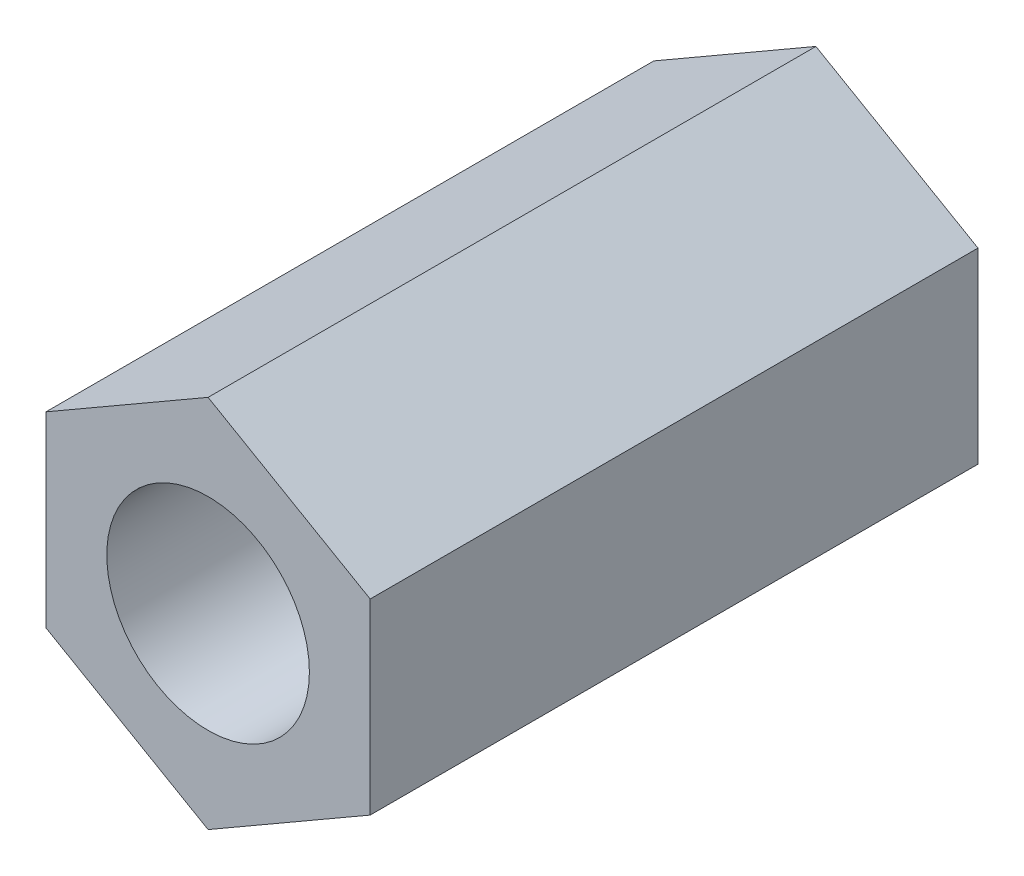
ISO-10303-21;
HEADER;
FILE_DESCRIPTION(('STEP AP214'),'2;1');
FILE_NAME('part.step','',(''),(''),'','','');
FILE_SCHEMA(('AUTOMOTIVE_DESIGN { 1 0 10303 214 1 1 1 1 }'));
ENDSEC;
DATA;
#1=APPLICATION_CONTEXT('core data for automotive mechanical design processes');
#2=APPLICATION_PROTOCOL_DEFINITION('international standard','automotive_design',2000,#1);
#3=PRODUCT_CONTEXT('',#1,'mechanical');
#4=PRODUCT('Part','Part','',(#3));
#5=PRODUCT_RELATED_PRODUCT_CATEGORY('part','',(#4));
#6=PRODUCT_DEFINITION_FORMATION('','',#4);
#7=PRODUCT_DEFINITION_CONTEXT('part definition',#1,'design');
#8=PRODUCT_DEFINITION('design','',#6,#7);
#9=PRODUCT_DEFINITION_SHAPE('','',#8);
#10=(LENGTH_UNIT() NAMED_UNIT(*) SI_UNIT(.MILLI.,.METRE.));
#11=(NAMED_UNIT(*) PLANE_ANGLE_UNIT() SI_UNIT($,.RADIAN.));
#12=(NAMED_UNIT(*) SI_UNIT($,.STERADIAN.) SOLID_ANGLE_UNIT());
#13=UNCERTAINTY_MEASURE_WITH_UNIT(LENGTH_MEASURE(1.E-05),#10,'distance_accuracy_value','');
#14=(GEOMETRIC_REPRESENTATION_CONTEXT(3) GLOBAL_UNCERTAINTY_ASSIGNED_CONTEXT((#13)) GLOBAL_UNIT_ASSIGNED_CONTEXT((#10,
#11,#12)) REPRESENTATION_CONTEXT('',''));
#15=CARTESIAN_POINT('',(0.,0.,0.));
#16=DIRECTION('',(0.,0.,1.));
#17=DIRECTION('',(1.,0.,0.));
#18=AXIS2_PLACEMENT_3D('',#15,#16,#17);
#19=CARTESIAN_POINT('',(-2.,3.46410161513775,15.));
#20=DIRECTION('',(0.5,-0.866025403784439,0.));
#21=DIRECTION('',(0.866025403784439,0.5,0.));
#22=AXIS2_PLACEMENT_3D('',#19,#20,#21);
#23=PLANE('',#22);
#24=DIRECTION('',(-0.866025403784439,-0.5,0.));
#25=VECTOR('',#24,1.);
#26=CARTESIAN_POINT('',(-2.,3.46410161513775,0.));
#27=LINE('',#26,#25);
#28=CARTESIAN_POINT('',(0.,4.61880215351701,0.));
#29=VERTEX_POINT('',#28);
#30=CARTESIAN_POINT('',(-4.,2.30940107675851,0.));
#31=VERTEX_POINT('',#30);
#32=EDGE_CURVE('E131',#29,#31,#27,.T.);
#33=ORIENTED_EDGE('',*,*,#32,.T.);
#34=DIRECTION('',(0.,0.,-1.));
#35=VECTOR('',#34,1.);
#36=CARTESIAN_POINT('',(-4.,2.30940107675851,15.));
#37=LINE('',#36,#35);
#38=CARTESIAN_POINT('',(-4.,2.30940107675851,15.));
#39=VERTEX_POINT('',#38);
#40=EDGE_CURVE('E10',#39,#31,#37,.T.);
#41=ORIENTED_EDGE('',*,*,#40,.F.);
#42=DIRECTION('',(-0.866025403784439,-0.5,0.));
#43=VECTOR('',#42,1.);
#44=CARTESIAN_POINT('',(-2.,3.46410161513775,15.));
#45=LINE('',#44,#43);
#46=CARTESIAN_POINT('',(0.,4.61880215351701,15.));
#47=VERTEX_POINT('',#46);
#48=EDGE_CURVE('E163',#47,#39,#45,.T.);
#49=ORIENTED_EDGE('',*,*,#48,.F.);
#50=DIRECTION('',(0.,0.,-1.));
#51=VECTOR('',#50,1.);
#52=CARTESIAN_POINT('',(0.,4.61880215351701,15.));
#53=LINE('',#52,#51);
#54=EDGE_CURVE('E123',#47,#29,#53,.T.);
#55=ORIENTED_EDGE('',*,*,#54,.T.);
#56=EDGE_LOOP('',(#33,#41,#49,#55));
#57=FACE_BOUND('',#56,.T.);
#58=ADVANCED_FACE('F16',(#57),#23,.F.);
#59=CARTESIAN_POINT('',(-4.,0.,15.));
#60=DIRECTION('',(1.,0.,0.));
#61=DIRECTION('',(0.,0.,-1.));
#62=AXIS2_PLACEMENT_3D('',#59,#60,#61);
#63=PLANE('',#62);
#64=DIRECTION('',(0.,-1.,0.));
#65=VECTOR('',#64,1.);
#66=CARTESIAN_POINT('',(-4.,0.,0.));
#67=LINE('',#66,#65);
#68=CARTESIAN_POINT('',(-4.,-2.30940107675851,0.));
#69=VERTEX_POINT('',#68);
#70=EDGE_CURVE('E135',#31,#69,#67,.T.);
#71=ORIENTED_EDGE('',*,*,#70,.T.);
#72=DIRECTION('',(0.,0.,-1.));
#73=VECTOR('',#72,1.);
#74=CARTESIAN_POINT('',(-4.,-2.30940107675851,15.));
#75=LINE('',#74,#73);
#76=CARTESIAN_POINT('',(-4.,-2.30940107675851,15.));
#77=VERTEX_POINT('',#76);
#78=EDGE_CURVE('E26',#77,#69,#75,.T.);
#79=ORIENTED_EDGE('',*,*,#78,.F.);
#80=DIRECTION('',(0.,-1.,0.));
#81=VECTOR('',#80,1.);
#82=CARTESIAN_POINT('',(-4.,0.,15.));
#83=LINE('',#82,#81);
#84=EDGE_CURVE('E86',#39,#77,#83,.T.);
#85=ORIENTED_EDGE('',*,*,#84,.F.);
#86=ORIENTED_EDGE('',*,*,#40,.T.);
#87=EDGE_LOOP('',(#71,#79,#85,#86));
#88=FACE_BOUND('',#87,.T.);
#89=ADVANCED_FACE('F178',(#88),#63,.F.);
#90=CARTESIAN_POINT('',(-2.,-3.46410161513775,15.));
#91=DIRECTION('',(0.5,0.866025403784439,0.));
#92=DIRECTION('',(-0.866025403784439,0.5,0.));
#93=AXIS2_PLACEMENT_3D('',#90,#91,#92);
#94=PLANE('',#93);
#95=DIRECTION('',(0.866025403784439,-0.5,0.));
#96=VECTOR('',#95,1.);
#97=CARTESIAN_POINT('',(-2.,-3.46410161513775,0.));
#98=LINE('',#97,#96);
#99=CARTESIAN_POINT('',(0.,-4.61880215351701,0.));
#100=VERTEX_POINT('',#99);
#101=EDGE_CURVE('E138',#69,#100,#98,.T.);
#102=ORIENTED_EDGE('',*,*,#101,.T.);
#103=DIRECTION('',(0.,0.,-1.));
#104=VECTOR('',#103,1.);
#105=CARTESIAN_POINT('',(0.,-4.61880215351701,15.));
#106=LINE('',#105,#104);
#107=CARTESIAN_POINT('',(0.,-4.61880215351701,15.));
#108=VERTEX_POINT('',#107);
#109=EDGE_CURVE('E113',#108,#100,#106,.T.);
#110=ORIENTED_EDGE('',*,*,#109,.F.);
#111=DIRECTION('',(0.866025403784439,-0.5,0.));
#112=VECTOR('',#111,1.);
#113=CARTESIAN_POINT('',(-2.,-3.46410161513775,15.));
#114=LINE('',#113,#112);
#115=EDGE_CURVE('E102',#77,#108,#114,.T.);
#116=ORIENTED_EDGE('',*,*,#115,.F.);
#117=ORIENTED_EDGE('',*,*,#78,.T.);
#118=EDGE_LOOP('',(#102,#110,#116,#117));
#119=FACE_BOUND('',#118,.T.);
#120=ADVANCED_FACE('F156',(#119),#94,.F.);
#121=CARTESIAN_POINT('',(2.,-3.46410161513775,15.));
#122=DIRECTION('',(-0.5,0.866025403784439,0.));
#123=DIRECTION('',(-0.866025403784439,-0.5,0.));
#124=AXIS2_PLACEMENT_3D('',#121,#122,#123);
#125=PLANE('',#124);
#126=DIRECTION('',(0.866025403784439,0.5,0.));
#127=VECTOR('',#126,1.);
#128=CARTESIAN_POINT('',(2.,-3.46410161513775,0.));
#129=LINE('',#128,#127);
#130=CARTESIAN_POINT('',(4.,-2.30940107675851,0.));
#131=VERTEX_POINT('',#130);
#132=EDGE_CURVE('E111',#100,#131,#129,.T.);
#133=ORIENTED_EDGE('',*,*,#132,.T.);
#134=DIRECTION('',(0.,0.,-1.));
#135=VECTOR('',#134,1.);
#136=CARTESIAN_POINT('',(4.,-2.30940107675851,15.));
#137=LINE('',#136,#135);
#138=CARTESIAN_POINT('',(4.,-2.30940107675851,15.));
#139=VERTEX_POINT('',#138);
#140=EDGE_CURVE('E108',#139,#131,#137,.T.);
#141=ORIENTED_EDGE('',*,*,#140,.F.);
#142=DIRECTION('',(0.866025403784439,0.5,0.));
#143=VECTOR('',#142,1.);
#144=CARTESIAN_POINT('',(2.,-3.46410161513775,15.));
#145=LINE('',#144,#143);
#146=EDGE_CURVE('E96',#108,#139,#145,.T.);
#147=ORIENTED_EDGE('',*,*,#146,.F.);
#148=ORIENTED_EDGE('',*,*,#109,.T.);
#149=EDGE_LOOP('',(#133,#141,#147,#148));
#150=FACE_BOUND('',#149,.T.);
#151=ADVANCED_FACE('F109',(#150),#125,.F.);
#152=CARTESIAN_POINT('',(4.,0.,15.));
#153=DIRECTION('',(-1.,0.,0.));
#154=DIRECTION('',(0.,0.,1.));
#155=AXIS2_PLACEMENT_3D('',#152,#153,#154);
#156=PLANE('',#155);
#157=DIRECTION('',(0.,1.,0.));
#158=VECTOR('',#157,1.);
#159=CARTESIAN_POINT('',(4.,0.,0.));
#160=LINE('',#159,#158);
#161=CARTESIAN_POINT('',(4.,2.3094010767585,0.));
#162=VERTEX_POINT('',#161);
#163=EDGE_CURVE('E69',#131,#162,#160,.T.);
#164=ORIENTED_EDGE('',*,*,#163,.T.);
#165=DIRECTION('',(0.,0.,-1.));
#166=VECTOR('',#165,1.);
#167=CARTESIAN_POINT('',(4.,2.3094010767585,15.));
#168=LINE('',#167,#166);
#169=CARTESIAN_POINT('',(4.,2.3094010767585,15.));
#170=VERTEX_POINT('',#169);
#171=EDGE_CURVE('E114',#170,#162,#168,.T.);
#172=ORIENTED_EDGE('',*,*,#171,.F.);
#173=DIRECTION('',(0.,1.,0.));
#174=VECTOR('',#173,1.);
#175=CARTESIAN_POINT('',(4.,0.,15.));
#176=LINE('',#175,#174);
#177=EDGE_CURVE('E100',#139,#170,#176,.T.);
#178=ORIENTED_EDGE('',*,*,#177,.F.);
#179=ORIENTED_EDGE('',*,*,#140,.T.);
#180=EDGE_LOOP('',(#164,#172,#178,#179));
#181=FACE_BOUND('',#180,.T.);
#182=ADVANCED_FACE('F116',(#181),#156,.F.);
#183=CARTESIAN_POINT('',(0.,0.,15.));
#184=DIRECTION('',(0.,0.,-1.));
#185=DIRECTION('',(-1.,0.,0.));
#186=AXIS2_PLACEMENT_3D('',#183,#184,#185);
#187=CYLINDRICAL_SURFACE('',#186,2.5);
#188=CARTESIAN_POINT('',(0.,0.,15.));
#189=DIRECTION('',(0.,0.,1.));
#190=DIRECTION('',(1.,0.,0.));
#191=AXIS2_PLACEMENT_3D('',#188,#189,#190);
#192=CIRCLE('',#191,2.5);
#193=CARTESIAN_POINT('',(2.5,0.,15.));
#194=VERTEX_POINT('',#193);
#195=EDGE_CURVE('E145',#194,#194,#192,.T.);
#196=ORIENTED_EDGE('',*,*,#195,.T.);
#197=EDGE_LOOP('',(#196));
#198=FACE_BOUND('',#197,.T.);
#199=CARTESIAN_POINT('',(0.,0.,0.));
#200=DIRECTION('',(0.,0.,1.));
#201=DIRECTION('',(1.,0.,0.));
#202=AXIS2_PLACEMENT_3D('',#199,#200,#201);
#203=CIRCLE('',#202,2.5);
#204=CARTESIAN_POINT('',(2.5,0.,0.));
#205=VERTEX_POINT('',#204);
#206=EDGE_CURVE('E127',#205,#205,#203,.T.);
#207=ORIENTED_EDGE('',*,*,#206,.F.);
#208=EDGE_LOOP('',(#207));
#209=FACE_BOUND('',#208,.T.);
#210=ADVANCED_FACE('F18',(#198,#209),#187,.F.);
#211=CARTESIAN_POINT('',(2.,3.46410161513775,15.));
#212=DIRECTION('',(-0.5,-0.866025403784438,0.));
#213=DIRECTION('',(0.866025403784438,-0.5,0.));
#214=AXIS2_PLACEMENT_3D('',#211,#212,#213);
#215=PLANE('',#214);
#216=DIRECTION('',(-0.866025403784438,0.5,0.));
#217=VECTOR('',#216,1.);
#218=CARTESIAN_POINT('',(2.,3.46410161513775,0.));
#219=LINE('',#218,#217);
#220=EDGE_CURVE('E76',#162,#29,#219,.T.);
#221=ORIENTED_EDGE('',*,*,#220,.T.);
#222=ORIENTED_EDGE('',*,*,#54,.F.);
#223=DIRECTION('',(-0.866025403784438,0.5,0.));
#224=VECTOR('',#223,1.);
#225=CARTESIAN_POINT('',(2.,3.46410161513775,15.));
#226=LINE('',#225,#224);
#227=EDGE_CURVE('E38',#170,#47,#226,.T.);
#228=ORIENTED_EDGE('',*,*,#227,.F.);
#229=ORIENTED_EDGE('',*,*,#171,.T.);
#230=EDGE_LOOP('',(#221,#222,#228,#229));
#231=FACE_BOUND('',#230,.T.);
#232=ADVANCED_FACE('F164',(#231),#215,.F.);
#233=CARTESIAN_POINT('',(0.,0.,15.));
#234=DIRECTION('',(0.,0.,1.));
#235=DIRECTION('',(1.,0.,0.));
#236=AXIS2_PLACEMENT_3D('',#233,#234,#235);
#237=PLANE('',#236);
#238=ORIENTED_EDGE('',*,*,#195,.F.);
#239=EDGE_LOOP('',(#238));
#240=FACE_BOUND('',#239,.T.);
#241=ORIENTED_EDGE('',*,*,#48,.T.);
#242=ORIENTED_EDGE('',*,*,#84,.T.);
#243=ORIENTED_EDGE('',*,*,#115,.T.);
#244=ORIENTED_EDGE('',*,*,#146,.T.);
#245=ORIENTED_EDGE('',*,*,#177,.T.);
#246=ORIENTED_EDGE('',*,*,#227,.T.);
#247=EDGE_LOOP('',(#241,#242,#243,#244,#245,#246));
#248=FACE_BOUND('',#247,.T.);
#249=ADVANCED_FACE('F98',(#240,#248),#237,.T.);
#250=CARTESIAN_POINT('',(0.,0.,0.));
#251=DIRECTION('',(0.,0.,1.));
#252=DIRECTION('',(1.,0.,0.));
#253=AXIS2_PLACEMENT_3D('',#250,#251,#252);
#254=PLANE('',#253);
#255=ORIENTED_EDGE('',*,*,#206,.T.);
#256=EDGE_LOOP('',(#255));
#257=FACE_BOUND('',#256,.T.);
#258=ORIENTED_EDGE('',*,*,#32,.F.);
#259=ORIENTED_EDGE('',*,*,#220,.F.);
#260=ORIENTED_EDGE('',*,*,#163,.F.);
#261=ORIENTED_EDGE('',*,*,#132,.F.);
#262=ORIENTED_EDGE('',*,*,#101,.F.);
#263=ORIENTED_EDGE('',*,*,#70,.F.);
#264=EDGE_LOOP('',(#258,#259,#260,#261,#262,#263));
#265=FACE_BOUND('',#264,.T.);
#266=ADVANCED_FACE('F159',(#257,#265),#254,.F.);
#267=CLOSED_SHELL('',(#58,#89,#120,#151,#182,#210,#232,#249,#266));
#268=MANIFOLD_SOLID_BREP('B1',#267);
#269=ADVANCED_BREP_SHAPE_REPRESENTATION('',(#18,#268),#14);
#270=SHAPE_DEFINITION_REPRESENTATION(#9,#269);
ENDSEC;
END-ISO-10303-21;
